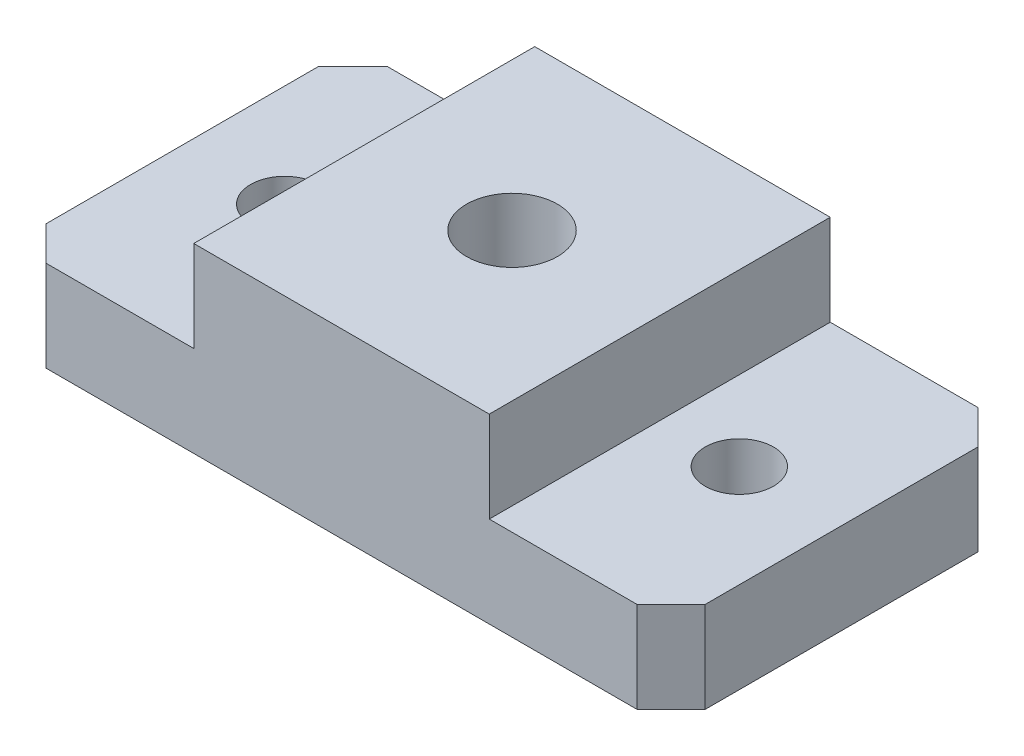
ISO-10303-21;
HEADER;
FILE_DESCRIPTION(('STEP AP214'),'2;1');
FILE_NAME('part.step','',(''),(''),'','','');
FILE_SCHEMA(('AUTOMOTIVE_DESIGN { 1 0 10303 214 1 1 1 1 }'));
ENDSEC;
DATA;
#1=APPLICATION_CONTEXT('core data for automotive mechanical design processes');
#2=APPLICATION_PROTOCOL_DEFINITION('international standard','automotive_design',2000,#1);
#3=PRODUCT_CONTEXT('',#1,'mechanical');
#4=PRODUCT('Part','Part','',(#3));
#5=PRODUCT_RELATED_PRODUCT_CATEGORY('part','',(#4));
#6=PRODUCT_DEFINITION_FORMATION('','',#4);
#7=PRODUCT_DEFINITION_CONTEXT('part definition',#1,'design');
#8=PRODUCT_DEFINITION('design','',#6,#7);
#9=PRODUCT_DEFINITION_SHAPE('','',#8);
#10=(LENGTH_UNIT() NAMED_UNIT(*) SI_UNIT(.MILLI.,.METRE.));
#11=(NAMED_UNIT(*) PLANE_ANGLE_UNIT() SI_UNIT($,.RADIAN.));
#12=(NAMED_UNIT(*) SI_UNIT($,.STERADIAN.) SOLID_ANGLE_UNIT());
#13=UNCERTAINTY_MEASURE_WITH_UNIT(LENGTH_MEASURE(1.E-05),#10,'distance_accuracy_value','');
#14=(GEOMETRIC_REPRESENTATION_CONTEXT(3) GLOBAL_UNCERTAINTY_ASSIGNED_CONTEXT((#13)) GLOBAL_UNIT_ASSIGNED_CONTEXT((#10,
#11,#12)) REPRESENTATION_CONTEXT('',''));
#15=CARTESIAN_POINT('',(0.,0.,0.));
#16=DIRECTION('',(0.,0.,1.));
#17=DIRECTION('',(1.,0.,0.));
#18=AXIS2_PLACEMENT_3D('',#15,#16,#17);
#19=CARTESIAN_POINT('',(0.,8.,0.));
#20=DIRECTION('',(0.,1.,0.));
#21=DIRECTION('',(0.,0.,1.));
#22=AXIS2_PLACEMENT_3D('',#19,#20,#21);
#23=PLANE('',#22);
#24=DIRECTION('',(1.,0.,0.));
#25=VECTOR('',#24,1.);
#26=CARTESIAN_POINT('',(-29.,8.,15.));
#27=LINE('',#26,#25);
#28=CARTESIAN_POINT('',(13.,8.,15.));
#29=VERTEX_POINT('',#28);
#30=CARTESIAN_POINT('',(26.,8.,15.));
#31=VERTEX_POINT('',#30);
#32=EDGE_CURVE('E193',#29,#31,#27,.T.);
#33=ORIENTED_EDGE('',*,*,#32,.T.);
#34=DIRECTION('',(-0.707106781186549,0.,0.707106781186546));
#35=VECTOR('',#34,1.);
#36=CARTESIAN_POINT('',(20.5,8.,20.5));
#37=LINE('',#36,#35);
#38=CARTESIAN_POINT('',(29.,8.,12.));
#39=VERTEX_POINT('',#38);
#40=EDGE_CURVE('E239',#31,#39,#37,.F.);
#41=ORIENTED_EDGE('',*,*,#40,.T.);
#42=DIRECTION('',(0.,0.,-1.));
#43=VECTOR('',#42,1.);
#44=CARTESIAN_POINT('',(29.,8.,-15.));
#45=LINE('',#44,#43);
#46=CARTESIAN_POINT('',(29.,8.,-12.));
#47=VERTEX_POINT('',#46);
#48=EDGE_CURVE('E181',#39,#47,#45,.T.);
#49=ORIENTED_EDGE('',*,*,#48,.T.);
#50=DIRECTION('',(0.707106781186547,0.,0.707106781186548));
#51=VECTOR('',#50,1.);
#52=CARTESIAN_POINT('',(20.5,8.,-20.5));
#53=LINE('',#52,#51);
#54=CARTESIAN_POINT('',(26.,8.,-15.));
#55=VERTEX_POINT('',#54);
#56=EDGE_CURVE('E236',#47,#55,#53,.F.);
#57=ORIENTED_EDGE('',*,*,#56,.T.);
#58=DIRECTION('',(-1.,0.,0.));
#59=VECTOR('',#58,1.);
#60=CARTESIAN_POINT('',(-29.,8.,-15.));
#61=LINE('',#60,#59);
#62=CARTESIAN_POINT('',(13.,8.,-15.));
#63=VERTEX_POINT('',#62);
#64=EDGE_CURVE('E187',#55,#63,#61,.T.);
#65=ORIENTED_EDGE('',*,*,#64,.T.);
#66=DIRECTION('',(0.,0.,-1.));
#67=VECTOR('',#66,1.);
#68=CARTESIAN_POINT('',(13.,8.,-15.));
#69=LINE('',#68,#67);
#70=EDGE_CURVE('E156',#29,#63,#69,.T.);
#71=ORIENTED_EDGE('',*,*,#70,.F.);
#72=EDGE_LOOP('',(#33,#41,#49,#57,#65,#71));
#73=FACE_BOUND('',#72,.T.);
#74=CARTESIAN_POINT('',(20.,8.,0.));
#75=DIRECTION('',(0.,1.,0.));
#76=DIRECTION('',(0.,0.,1.));
#77=AXIS2_PLACEMENT_3D('',#74,#75,#76);
#78=CIRCLE('',#77,2.99999999999999);
#79=CARTESIAN_POINT('',(20.,8.,2.99999999999999));
#80=VERTEX_POINT('',#79);
#81=EDGE_CURVE('E163',#80,#80,#78,.T.);
#82=ORIENTED_EDGE('',*,*,#81,.F.);
#83=EDGE_LOOP('',(#82));
#84=FACE_BOUND('',#83,.T.);
#85=ADVANCED_FACE('F39',(#73,#84),#23,.T.);
#86=CARTESIAN_POINT('',(-13.,8.,-15.));
#87=VERTEX_POINT('',#86);
#88=CARTESIAN_POINT('',(-26.,8.,-15.));
#89=VERTEX_POINT('',#88);
#90=EDGE_CURVE('E185',#87,#89,#61,.T.);
#91=ORIENTED_EDGE('',*,*,#90,.T.);
#92=DIRECTION('',(0.707106781186548,0.,-0.707106781186547));
#93=VECTOR('',#92,1.);
#94=CARTESIAN_POINT('',(-20.5,8.,-20.5));
#95=LINE('',#94,#93);
#96=CARTESIAN_POINT('',(-29.,8.,-12.));
#97=VERTEX_POINT('',#96);
#98=EDGE_CURVE('E11',#89,#97,#95,.F.);
#99=ORIENTED_EDGE('',*,*,#98,.T.);
#100=DIRECTION('',(0.,0.,1.));
#101=VECTOR('',#100,1.);
#102=CARTESIAN_POINT('',(-29.,8.,-15.));
#103=LINE('',#102,#101);
#104=CARTESIAN_POINT('',(-29.,8.,12.));
#105=VERTEX_POINT('',#104);
#106=EDGE_CURVE('E190',#97,#105,#103,.T.);
#107=ORIENTED_EDGE('',*,*,#106,.T.);
#108=DIRECTION('',(-0.707106781186546,0.,-0.707106781186549));
#109=VECTOR('',#108,1.);
#110=CARTESIAN_POINT('',(-20.5000000000001,8.,20.5));
#111=LINE('',#110,#109);
#112=CARTESIAN_POINT('',(-26.,8.,15.));
#113=VERTEX_POINT('',#112);
#114=EDGE_CURVE('E48',#105,#113,#111,.F.);
#115=ORIENTED_EDGE('',*,*,#114,.T.);
#116=CARTESIAN_POINT('',(-13.,8.,15.));
#117=VERTEX_POINT('',#116);
#118=EDGE_CURVE('E194',#113,#117,#27,.T.);
#119=ORIENTED_EDGE('',*,*,#118,.T.);
#120=DIRECTION('',(0.,0.,1.));
#121=VECTOR('',#120,1.);
#122=CARTESIAN_POINT('',(-13.,8.,-15.));
#123=LINE('',#122,#121);
#124=EDGE_CURVE('E153',#87,#117,#123,.T.);
#125=ORIENTED_EDGE('',*,*,#124,.F.);
#126=EDGE_LOOP('',(#91,#99,#107,#115,#119,#125));
#127=FACE_BOUND('',#126,.T.);
#128=CARTESIAN_POINT('',(-20.,8.,0.));
#129=DIRECTION('',(0.,1.,0.));
#130=DIRECTION('',(0.,0.,1.));
#131=AXIS2_PLACEMENT_3D('',#128,#129,#130);
#132=CIRCLE('',#131,3.);
#133=CARTESIAN_POINT('',(-20.,8.,3.));
#134=VERTEX_POINT('',#133);
#135=EDGE_CURVE('E173',#134,#134,#132,.T.);
#136=ORIENTED_EDGE('',*,*,#135,.F.);
#137=EDGE_LOOP('',(#136));
#138=FACE_BOUND('',#137,.T.);
#139=ADVANCED_FACE('F257',(#127,#138),#23,.T.);
#140=CARTESIAN_POINT('',(0.,0.,0.));
#141=DIRECTION('',(0.,1.,0.));
#142=DIRECTION('',(0.,0.,1.));
#143=AXIS2_PLACEMENT_3D('',#140,#141,#142);
#144=PLANE('',#143);
#145=CARTESIAN_POINT('',(0.,0.,0.));
#146=DIRECTION('',(0.,1.,0.));
#147=DIRECTION('',(0.,0.,1.));
#148=AXIS2_PLACEMENT_3D('',#145,#146,#147);
#149=CIRCLE('',#148,4.);
#150=CARTESIAN_POINT('',(0.,0.,4.));
#151=VERTEX_POINT('',#150);
#152=EDGE_CURVE('E307',#151,#151,#149,.T.);
#153=ORIENTED_EDGE('',*,*,#152,.T.);
#154=EDGE_LOOP('',(#153));
#155=FACE_BOUND('',#154,.T.);
#156=DIRECTION('',(0.,0.,-1.));
#157=VECTOR('',#156,1.);
#158=CARTESIAN_POINT('',(29.,0.,-15.));
#159=LINE('',#158,#157);
#160=CARTESIAN_POINT('',(29.,0.,12.));
#161=VERTEX_POINT('',#160);
#162=CARTESIAN_POINT('',(29.,0.,-12.));
#163=VERTEX_POINT('',#162);
#164=EDGE_CURVE('E177',#161,#163,#159,.T.);
#165=ORIENTED_EDGE('',*,*,#164,.F.);
#166=DIRECTION('',(0.707106781186549,0.,-0.707106781186546));
#167=VECTOR('',#166,1.);
#168=CARTESIAN_POINT('',(29.,0.,12.));
#169=LINE('',#168,#167);
#170=CARTESIAN_POINT('',(26.,0.,15.));
#171=VERTEX_POINT('',#170);
#172=EDGE_CURVE('E226',#161,#171,#169,.F.);
#173=ORIENTED_EDGE('',*,*,#172,.T.);
#174=DIRECTION('',(1.,0.,0.));
#175=VECTOR('',#174,1.);
#176=CARTESIAN_POINT('',(-29.,0.,15.));
#177=LINE('',#176,#175);
#178=CARTESIAN_POINT('',(-26.,0.,15.));
#179=VERTEX_POINT('',#178);
#180=EDGE_CURVE('E186',#179,#171,#177,.T.);
#181=ORIENTED_EDGE('',*,*,#180,.F.);
#182=DIRECTION('',(0.707106781186546,0.,0.707106781186549));
#183=VECTOR('',#182,1.);
#184=CARTESIAN_POINT('',(-26.,0.,15.));
#185=LINE('',#184,#183);
#186=CARTESIAN_POINT('',(-29.,0.,12.));
#187=VERTEX_POINT('',#186);
#188=EDGE_CURVE('E217',#179,#187,#185,.F.);
#189=ORIENTED_EDGE('',*,*,#188,.T.);
#190=DIRECTION('',(0.,0.,1.));
#191=VECTOR('',#190,1.);
#192=CARTESIAN_POINT('',(-29.,0.,-15.));
#193=LINE('',#192,#191);
#194=CARTESIAN_POINT('',(-29.,0.,-12.));
#195=VERTEX_POINT('',#194);
#196=EDGE_CURVE('E205',#195,#187,#193,.T.);
#197=ORIENTED_EDGE('',*,*,#196,.F.);
#198=DIRECTION('',(-0.707106781186548,0.,0.707106781186547));
#199=VECTOR('',#198,1.);
#200=CARTESIAN_POINT('',(-29.,0.,-12.));
#201=LINE('',#200,#199);
#202=CARTESIAN_POINT('',(-26.,0.,-15.));
#203=VERTEX_POINT('',#202);
#204=EDGE_CURVE('E220',#195,#203,#201,.F.);
#205=ORIENTED_EDGE('',*,*,#204,.T.);
#206=DIRECTION('',(-1.,0.,0.));
#207=VECTOR('',#206,1.);
#208=CARTESIAN_POINT('',(-29.,0.,-15.));
#209=LINE('',#208,#207);
#210=CARTESIAN_POINT('',(26.,0.,-15.));
#211=VERTEX_POINT('',#210);
#212=EDGE_CURVE('E201',#211,#203,#209,.T.);
#213=ORIENTED_EDGE('',*,*,#212,.F.);
#214=DIRECTION('',(-0.707106781186547,0.,-0.707106781186548));
#215=VECTOR('',#214,1.);
#216=CARTESIAN_POINT('',(26.,0.,-15.));
#217=LINE('',#216,#215);
#218=EDGE_CURVE('E223',#211,#163,#217,.F.);
#219=ORIENTED_EDGE('',*,*,#218,.T.);
#220=EDGE_LOOP('',(#165,#173,#181,#189,#197,#205,#213,#219));
#221=FACE_BOUND('',#220,.T.);
#222=CARTESIAN_POINT('',(-20.,0.,0.));
#223=DIRECTION('',(0.,1.,0.));
#224=DIRECTION('',(0.,0.,1.));
#225=AXIS2_PLACEMENT_3D('',#222,#223,#224);
#226=CIRCLE('',#225,3.);
#227=CARTESIAN_POINT('',(-20.,0.,3.));
#228=VERTEX_POINT('',#227);
#229=EDGE_CURVE('E171',#228,#228,#226,.T.);
#230=ORIENTED_EDGE('',*,*,#229,.T.);
#231=EDGE_LOOP('',(#230));
#232=FACE_BOUND('',#231,.T.);
#233=CARTESIAN_POINT('',(20.,0.,0.));
#234=DIRECTION('',(0.,1.,0.));
#235=DIRECTION('',(0.,0.,1.));
#236=AXIS2_PLACEMENT_3D('',#233,#234,#235);
#237=CIRCLE('',#236,2.99999999999999);
#238=CARTESIAN_POINT('',(20.,0.,2.99999999999999));
#239=VERTEX_POINT('',#238);
#240=EDGE_CURVE('E158',#239,#239,#237,.T.);
#241=ORIENTED_EDGE('',*,*,#240,.T.);
#242=EDGE_LOOP('',(#241));
#243=FACE_BOUND('',#242,.T.);
#244=ADVANCED_FACE('F270',(#155,#221,#232,#243),#144,.F.);
#245=CARTESIAN_POINT('',(29.,8.,-15.));
#246=DIRECTION('',(-1.,0.,0.));
#247=DIRECTION('',(0.,0.,1.));
#248=AXIS2_PLACEMENT_3D('',#245,#246,#247);
#249=PLANE('',#248);
#250=ORIENTED_EDGE('',*,*,#48,.F.);
#251=DIRECTION('',(0.,-1.,0.));
#252=VECTOR('',#251,1.);
#253=CARTESIAN_POINT('',(29.,8.,12.));
#254=LINE('',#253,#252);
#255=EDGE_CURVE('E213',#39,#161,#254,.T.);
#256=ORIENTED_EDGE('',*,*,#255,.T.);
#257=ORIENTED_EDGE('',*,*,#164,.T.);
#258=DIRECTION('',(0.,1.,0.));
#259=VECTOR('',#258,1.);
#260=CARTESIAN_POINT('',(29.,8.,-12.));
#261=LINE('',#260,#259);
#262=EDGE_CURVE('E197',#163,#47,#261,.T.);
#263=ORIENTED_EDGE('',*,*,#262,.T.);
#264=EDGE_LOOP('',(#250,#256,#257,#263));
#265=FACE_BOUND('',#264,.T.);
#266=ADVANCED_FACE('F285',(#265),#249,.F.);
#267=CARTESIAN_POINT('',(-29.,8.,-15.));
#268=DIRECTION('',(0.,0.,1.));
#269=DIRECTION('',(1.,0.,0.));
#270=AXIS2_PLACEMENT_3D('',#267,#268,#269);
#271=PLANE('',#270);
#272=ORIENTED_EDGE('',*,*,#64,.F.);
#273=DIRECTION('',(0.,-1.,0.));
#274=VECTOR('',#273,1.);
#275=CARTESIAN_POINT('',(26.,8.,-15.));
#276=LINE('',#275,#274);
#277=EDGE_CURVE('E245',#55,#211,#276,.T.);
#278=ORIENTED_EDGE('',*,*,#277,.T.);
#279=ORIENTED_EDGE('',*,*,#212,.T.);
#280=DIRECTION('',(0.,1.,0.));
#281=VECTOR('',#280,1.);
#282=CARTESIAN_POINT('',(-26.,8.,-15.));
#283=LINE('',#282,#281);
#284=EDGE_CURVE('E242',#203,#89,#283,.T.);
#285=ORIENTED_EDGE('',*,*,#284,.T.);
#286=ORIENTED_EDGE('',*,*,#90,.F.);
#287=DIRECTION('',(0.,-1.,0.));
#288=VECTOR('',#287,1.);
#289=CARTESIAN_POINT('',(-13.,16.,-15.));
#290=LINE('',#289,#288);
#291=CARTESIAN_POINT('',(-13.,16.,-15.));
#292=VERTEX_POINT('',#291);
#293=EDGE_CURVE('E138',#292,#87,#290,.T.);
#294=ORIENTED_EDGE('',*,*,#293,.F.);
#295=DIRECTION('',(-1.,0.,0.));
#296=VECTOR('',#295,1.);
#297=CARTESIAN_POINT('',(-13.,16.,-15.));
#298=LINE('',#297,#296);
#299=CARTESIAN_POINT('',(13.,16.,-15.));
#300=VERTEX_POINT('',#299);
#301=EDGE_CURVE('E129',#300,#292,#298,.T.);
#302=ORIENTED_EDGE('',*,*,#301,.F.);
#303=DIRECTION('',(0.,-1.,0.));
#304=VECTOR('',#303,1.);
#305=CARTESIAN_POINT('',(13.,16.,-15.));
#306=LINE('',#305,#304);
#307=EDGE_CURVE('E134',#300,#63,#306,.T.);
#308=ORIENTED_EDGE('',*,*,#307,.T.);
#309=EDGE_LOOP('',(#272,#278,#279,#285,#286,#294,#302,#308));
#310=FACE_BOUND('',#309,.T.);
#311=ADVANCED_FACE('F132',(#310),#271,.F.);
#312=CARTESIAN_POINT('',(-29.,8.,-15.));
#313=DIRECTION('',(1.,0.,0.));
#314=DIRECTION('',(0.,0.,-1.));
#315=AXIS2_PLACEMENT_3D('',#312,#313,#314);
#316=PLANE('',#315);
#317=ORIENTED_EDGE('',*,*,#106,.F.);
#318=DIRECTION('',(0.,-1.,0.));
#319=VECTOR('',#318,1.);
#320=CARTESIAN_POINT('',(-29.,8.,-12.));
#321=LINE('',#320,#319);
#322=EDGE_CURVE('E251',#97,#195,#321,.T.);
#323=ORIENTED_EDGE('',*,*,#322,.T.);
#324=ORIENTED_EDGE('',*,*,#196,.T.);
#325=DIRECTION('',(0.,1.,0.));
#326=VECTOR('',#325,1.);
#327=CARTESIAN_POINT('',(-29.,8.,12.));
#328=LINE('',#327,#326);
#329=EDGE_CURVE('E55',#187,#105,#328,.T.);
#330=ORIENTED_EDGE('',*,*,#329,.T.);
#331=EDGE_LOOP('',(#317,#323,#324,#330));
#332=FACE_BOUND('',#331,.T.);
#333=ADVANCED_FACE('F272',(#332),#316,.F.);
#334=CARTESIAN_POINT('',(-29.,8.,15.));
#335=DIRECTION('',(0.,0.,-1.));
#336=DIRECTION('',(-1.,0.,0.));
#337=AXIS2_PLACEMENT_3D('',#334,#335,#336);
#338=PLANE('',#337);
#339=ORIENTED_EDGE('',*,*,#180,.T.);
#340=DIRECTION('',(0.,1.,0.));
#341=VECTOR('',#340,1.);
#342=CARTESIAN_POINT('',(26.,8.,15.));
#343=LINE('',#342,#341);
#344=EDGE_CURVE('E233',#171,#31,#343,.T.);
#345=ORIENTED_EDGE('',*,*,#344,.T.);
#346=ORIENTED_EDGE('',*,*,#32,.F.);
#347=DIRECTION('',(0.,-1.,0.));
#348=VECTOR('',#347,1.);
#349=CARTESIAN_POINT('',(13.,16.,15.));
#350=LINE('',#349,#348);
#351=CARTESIAN_POINT('',(13.,16.,15.));
#352=VERTEX_POINT('',#351);
#353=EDGE_CURVE('E302',#352,#29,#350,.T.);
#354=ORIENTED_EDGE('',*,*,#353,.F.);
#355=DIRECTION('',(1.,0.,0.));
#356=VECTOR('',#355,1.);
#357=CARTESIAN_POINT('',(-13.,16.,15.));
#358=LINE('',#357,#356);
#359=CARTESIAN_POINT('',(-13.,16.,15.));
#360=VERTEX_POINT('',#359);
#361=EDGE_CURVE('E148',#360,#352,#358,.T.);
#362=ORIENTED_EDGE('',*,*,#361,.F.);
#363=DIRECTION('',(0.,-1.,0.));
#364=VECTOR('',#363,1.);
#365=CARTESIAN_POINT('',(-13.,16.,15.));
#366=LINE('',#365,#364);
#367=EDGE_CURVE('E165',#360,#117,#366,.T.);
#368=ORIENTED_EDGE('',*,*,#367,.T.);
#369=ORIENTED_EDGE('',*,*,#118,.F.);
#370=DIRECTION('',(0.,-1.,0.));
#371=VECTOR('',#370,1.);
#372=CARTESIAN_POINT('',(-26.,8.,15.));
#373=LINE('',#372,#371);
#374=EDGE_CURVE('E229',#113,#179,#373,.T.);
#375=ORIENTED_EDGE('',*,*,#374,.T.);
#376=EDGE_LOOP('',(#339,#345,#346,#354,#362,#368,#369,#375));
#377=FACE_BOUND('',#376,.T.);
#378=ADVANCED_FACE('F264',(#377),#338,.F.);
#379=CARTESIAN_POINT('',(-20.,8.,0.));
#380=DIRECTION('',(0.,-1.,0.));
#381=DIRECTION('',(0.,0.,-1.));
#382=AXIS2_PLACEMENT_3D('',#379,#380,#381);
#383=CYLINDRICAL_SURFACE('',#382,3.);
#384=ORIENTED_EDGE('',*,*,#135,.T.);
#385=EDGE_LOOP('',(#384));
#386=FACE_BOUND('',#385,.T.);
#387=ORIENTED_EDGE('',*,*,#229,.F.);
#388=EDGE_LOOP('',(#387));
#389=FACE_BOUND('',#388,.T.);
#390=ADVANCED_FACE('F339',(#386,#389),#383,.F.);
#391=CARTESIAN_POINT('',(20.,8.,0.));
#392=DIRECTION('',(0.,-1.,0.));
#393=DIRECTION('',(0.,0.,-1.));
#394=AXIS2_PLACEMENT_3D('',#391,#392,#393);
#395=CYLINDRICAL_SURFACE('',#394,2.99999999999999);
#396=ORIENTED_EDGE('',*,*,#81,.T.);
#397=EDGE_LOOP('',(#396));
#398=FACE_BOUND('',#397,.T.);
#399=ORIENTED_EDGE('',*,*,#240,.F.);
#400=EDGE_LOOP('',(#399));
#401=FACE_BOUND('',#400,.T.);
#402=ADVANCED_FACE('F446',(#398,#401),#395,.F.);
#403=CARTESIAN_POINT('',(13.,16.,-15.));
#404=DIRECTION('',(-1.,0.,0.));
#405=DIRECTION('',(0.,0.,1.));
#406=AXIS2_PLACEMENT_3D('',#403,#404,#405);
#407=PLANE('',#406);
#408=ORIENTED_EDGE('',*,*,#70,.T.);
#409=ORIENTED_EDGE('',*,*,#307,.F.);
#410=DIRECTION('',(0.,0.,-1.));
#411=VECTOR('',#410,1.);
#412=CARTESIAN_POINT('',(13.,16.,-15.));
#413=LINE('',#412,#411);
#414=EDGE_CURVE('E143',#352,#300,#413,.T.);
#415=ORIENTED_EDGE('',*,*,#414,.F.);
#416=ORIENTED_EDGE('',*,*,#353,.T.);
#417=EDGE_LOOP('',(#408,#409,#415,#416));
#418=FACE_BOUND('',#417,.T.);
#419=ADVANCED_FACE('F155',(#418),#407,.F.);
#420=CARTESIAN_POINT('',(-13.,16.,-15.));
#421=DIRECTION('',(1.,0.,0.));
#422=DIRECTION('',(0.,0.,-1.));
#423=AXIS2_PLACEMENT_3D('',#420,#421,#422);
#424=PLANE('',#423);
#425=ORIENTED_EDGE('',*,*,#124,.T.);
#426=ORIENTED_EDGE('',*,*,#367,.F.);
#427=DIRECTION('',(0.,0.,1.));
#428=VECTOR('',#427,1.);
#429=CARTESIAN_POINT('',(-13.,16.,-15.));
#430=LINE('',#429,#428);
#431=EDGE_CURVE('E142',#292,#360,#430,.T.);
#432=ORIENTED_EDGE('',*,*,#431,.F.);
#433=ORIENTED_EDGE('',*,*,#293,.T.);
#434=EDGE_LOOP('',(#425,#426,#432,#433));
#435=FACE_BOUND('',#434,.T.);
#436=ADVANCED_FACE('F298',(#435),#424,.F.);
#437=CARTESIAN_POINT('',(0.,16.,0.));
#438=DIRECTION('',(0.,1.,0.));
#439=DIRECTION('',(0.,0.,1.));
#440=AXIS2_PLACEMENT_3D('',#437,#438,#439);
#441=PLANE('',#440);
#442=CARTESIAN_POINT('',(0.,16.,0.));
#443=DIRECTION('',(0.,1.,0.));
#444=DIRECTION('',(0.,0.,1.));
#445=AXIS2_PLACEMENT_3D('',#442,#443,#444);
#446=CIRCLE('',#445,4.);
#447=CARTESIAN_POINT('',(0.,16.,4.));
#448=VERTEX_POINT('',#447);
#449=EDGE_CURVE('E315',#448,#448,#446,.T.);
#450=ORIENTED_EDGE('',*,*,#449,.F.);
#451=EDGE_LOOP('',(#450));
#452=FACE_BOUND('',#451,.T.);
#453=ORIENTED_EDGE('',*,*,#414,.T.);
#454=ORIENTED_EDGE('',*,*,#301,.T.);
#455=ORIENTED_EDGE('',*,*,#431,.T.);
#456=ORIENTED_EDGE('',*,*,#361,.T.);
#457=EDGE_LOOP('',(#453,#454,#455,#456));
#458=FACE_BOUND('',#457,.T.);
#459=ADVANCED_FACE('F146',(#452,#458),#441,.T.);
#460=CARTESIAN_POINT('',(0.,0.,0.));
#461=DIRECTION('',(0.,1.,0.));
#462=DIRECTION('',(0.,0.,1.));
#463=AXIS2_PLACEMENT_3D('',#460,#461,#462);
#464=CYLINDRICAL_SURFACE('',#463,4.);
#465=ORIENTED_EDGE('',*,*,#152,.F.);
#466=EDGE_LOOP('',(#465));
#467=FACE_BOUND('',#466,.T.);
#468=ORIENTED_EDGE('',*,*,#449,.T.);
#469=EDGE_LOOP('',(#468));
#470=FACE_BOUND('',#469,.T.);
#471=ADVANCED_FACE('F321',(#467,#470),#464,.F.);
#472=CARTESIAN_POINT('',(29.,8.,12.));
#473=DIRECTION('',(-0.707106781186546,0.,-0.707106781186549));
#474=DIRECTION('',(0.,-1.,0.));
#475=AXIS2_PLACEMENT_3D('',#472,#473,#474);
#476=PLANE('',#475);
#477=ORIENTED_EDGE('',*,*,#40,.F.);
#478=ORIENTED_EDGE('',*,*,#344,.F.);
#479=ORIENTED_EDGE('',*,*,#172,.F.);
#480=ORIENTED_EDGE('',*,*,#255,.F.);
#481=EDGE_LOOP('',(#477,#478,#479,#480));
#482=FACE_BOUND('',#481,.T.);
#483=ADVANCED_FACE('F289',(#482),#476,.F.);
#484=CARTESIAN_POINT('',(26.,8.,-15.));
#485=DIRECTION('',(-0.707106781186548,0.,0.707106781186547));
#486=DIRECTION('',(0.,-1.,0.));
#487=AXIS2_PLACEMENT_3D('',#484,#485,#486);
#488=PLANE('',#487);
#489=ORIENTED_EDGE('',*,*,#56,.F.);
#490=ORIENTED_EDGE('',*,*,#262,.F.);
#491=ORIENTED_EDGE('',*,*,#218,.F.);
#492=ORIENTED_EDGE('',*,*,#277,.F.);
#493=EDGE_LOOP('',(#489,#490,#491,#492));
#494=FACE_BOUND('',#493,.T.);
#495=ADVANCED_FACE('F281',(#494),#488,.F.);
#496=CARTESIAN_POINT('',(-29.,8.,-12.));
#497=DIRECTION('',(0.707106781186547,0.,0.707106781186548));
#498=DIRECTION('',(0.,-1.,0.));
#499=AXIS2_PLACEMENT_3D('',#496,#497,#498);
#500=PLANE('',#499);
#501=ORIENTED_EDGE('',*,*,#98,.F.);
#502=ORIENTED_EDGE('',*,*,#284,.F.);
#503=ORIENTED_EDGE('',*,*,#204,.F.);
#504=ORIENTED_EDGE('',*,*,#322,.F.);
#505=EDGE_LOOP('',(#501,#502,#503,#504));
#506=FACE_BOUND('',#505,.T.);
#507=ADVANCED_FACE('F275',(#506),#500,.F.);
#508=CARTESIAN_POINT('',(-26.,8.,15.));
#509=DIRECTION('',(0.707106781186549,0.,-0.707106781186546));
#510=DIRECTION('',(0.,-1.,0.));
#511=AXIS2_PLACEMENT_3D('',#508,#509,#510);
#512=PLANE('',#511);
#513=ORIENTED_EDGE('',*,*,#114,.F.);
#514=ORIENTED_EDGE('',*,*,#329,.F.);
#515=ORIENTED_EDGE('',*,*,#188,.F.);
#516=ORIENTED_EDGE('',*,*,#374,.F.);
#517=EDGE_LOOP('',(#513,#514,#515,#516));
#518=FACE_BOUND('',#517,.T.);
#519=ADVANCED_FACE('F41',(#518),#512,.F.);
#520=CLOSED_SHELL('',(#85,#139,#244,#266,#311,#333,#378,#390,#402,#419,#436,#459,#471,#483,#495,
#507,#519));
#521=MANIFOLD_SOLID_BREP('B2',#520);
#522=ADVANCED_BREP_SHAPE_REPRESENTATION('',(#18,#521),#14);
#523=SHAPE_DEFINITION_REPRESENTATION(#9,#522);
ENDSEC;
END-ISO-10303-21;
